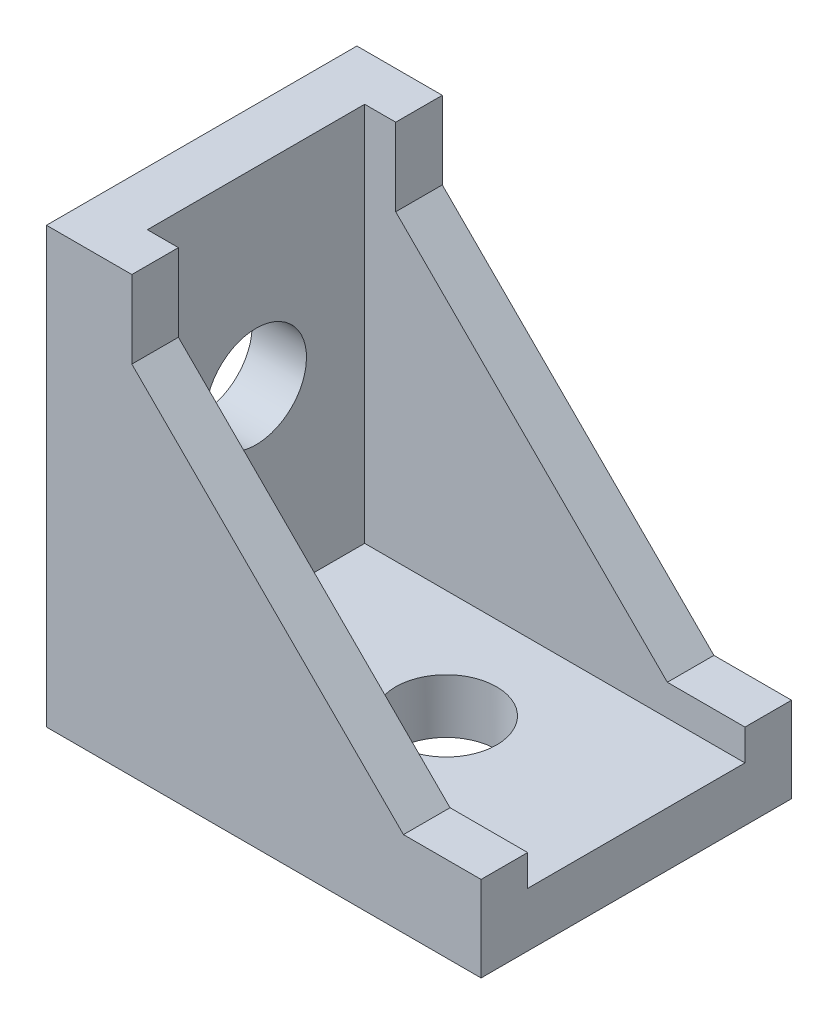
ISO-10303-21;
HEADER;
FILE_DESCRIPTION(('STEP AP214'),'2;1');
FILE_NAME('part.step','',(''),(''),'','','');
FILE_SCHEMA(('AUTOMOTIVE_DESIGN { 1 0 10303 214 1 1 1 1 }'));
ENDSEC;
DATA;
#1=APPLICATION_CONTEXT('core data for automotive mechanical design processes');
#2=APPLICATION_PROTOCOL_DEFINITION('international standard','automotive_design',2000,#1);
#3=PRODUCT_CONTEXT('',#1,'mechanical');
#4=PRODUCT('Part','Part','',(#3));
#5=PRODUCT_RELATED_PRODUCT_CATEGORY('part','',(#4));
#6=PRODUCT_DEFINITION_FORMATION('','',#4);
#7=PRODUCT_DEFINITION_CONTEXT('part definition',#1,'design');
#8=PRODUCT_DEFINITION('design','',#6,#7);
#9=PRODUCT_DEFINITION_SHAPE('','',#8);
#10=(LENGTH_UNIT() NAMED_UNIT(*) SI_UNIT(.MILLI.,.METRE.));
#11=(NAMED_UNIT(*) PLANE_ANGLE_UNIT() SI_UNIT($,.RADIAN.));
#12=(NAMED_UNIT(*) SI_UNIT($,.STERADIAN.) SOLID_ANGLE_UNIT());
#13=UNCERTAINTY_MEASURE_WITH_UNIT(LENGTH_MEASURE(1.E-05),#10,'distance_accuracy_value','');
#14=(GEOMETRIC_REPRESENTATION_CONTEXT(3) GLOBAL_UNCERTAINTY_ASSIGNED_CONTEXT((#13)) GLOBAL_UNIT_ASSIGNED_CONTEXT((#10,
#11,#12)) REPRESENTATION_CONTEXT('',''));
#15=CARTESIAN_POINT('',(0.,0.,0.));
#16=DIRECTION('',(0.,0.,1.));
#17=DIRECTION('',(1.,0.,0.));
#18=AXIS2_PLACEMENT_3D('',#15,#16,#17);
#19=CARTESIAN_POINT('',(3.5,3.5,10.));
#20=DIRECTION('',(0.,-1.,0.));
#21=DIRECTION('',(0.,0.,-1.));
#22=AXIS2_PLACEMENT_3D('',#19,#20,#21);
#23=PLANE('',#22);
#24=CARTESIAN_POINT('',(15.75,3.5,0.));
#25=DIRECTION('',(0.,-1.,0.));
#26=DIRECTION('',(0.,0.,-1.));
#27=AXIS2_PLACEMENT_3D('',#24,#25,#26);
#28=CIRCLE('',#27,3.25);
#29=CARTESIAN_POINT('',(15.75,3.5,-3.25));
#30=VERTEX_POINT('',#29);
#31=EDGE_CURVE('E174',#30,#30,#28,.T.);
#32=ORIENTED_EDGE('',*,*,#31,.T.);
#33=EDGE_LOOP('',(#32));
#34=FACE_BOUND('',#33,.T.);
#35=DIRECTION('',(-1.,0.,0.));
#36=VECTOR('',#35,1.);
#37=CARTESIAN_POINT('',(0.,3.5,-7.));
#38=LINE('',#37,#36);
#39=CARTESIAN_POINT('',(28.,3.5,-7.));
#40=VERTEX_POINT('',#39);
#41=CARTESIAN_POINT('',(3.5,3.5,-7.));
#42=VERTEX_POINT('',#41);
#43=EDGE_CURVE('E51',#40,#42,#38,.T.);
#44=ORIENTED_EDGE('',*,*,#43,.T.);
#45=DIRECTION('',(0.,0.,-1.));
#46=VECTOR('',#45,1.);
#47=CARTESIAN_POINT('',(3.5,3.5,10.));
#48=LINE('',#47,#46);
#49=CARTESIAN_POINT('',(3.5,3.5,7.));
#50=VERTEX_POINT('',#49);
#51=EDGE_CURVE('E245',#50,#42,#48,.T.);
#52=ORIENTED_EDGE('',*,*,#51,.F.);
#53=DIRECTION('',(-1.,0.,0.));
#54=VECTOR('',#53,1.);
#55=CARTESIAN_POINT('',(0.,3.5,7.));
#56=LINE('',#55,#54);
#57=CARTESIAN_POINT('',(28.,3.5,7.));
#58=VERTEX_POINT('',#57);
#59=EDGE_CURVE('E201',#58,#50,#56,.T.);
#60=ORIENTED_EDGE('',*,*,#59,.F.);
#61=DIRECTION('',(0.,0.,-1.));
#62=VECTOR('',#61,1.);
#63=CARTESIAN_POINT('',(28.,3.5,10.));
#64=LINE('',#63,#62);
#65=EDGE_CURVE('E44',#58,#40,#64,.T.);
#66=ORIENTED_EDGE('',*,*,#65,.T.);
#67=EDGE_LOOP('',(#44,#52,#60,#66));
#68=FACE_BOUND('',#67,.T.);
#69=ADVANCED_FACE('F36',(#34,#68),#23,.F.);
#70=CARTESIAN_POINT('',(3.5,28.,10.));
#71=DIRECTION('',(-1.,0.,0.));
#72=DIRECTION('',(0.,-1.,0.));
#73=AXIS2_PLACEMENT_3D('',#70,#71,#72);
#74=PLANE('',#73);
#75=CARTESIAN_POINT('',(3.5,15.75,0.));
#76=DIRECTION('',(1.,0.,0.));
#77=DIRECTION('',(0.,1.,0.));
#78=AXIS2_PLACEMENT_3D('',#75,#76,#77);
#79=CIRCLE('',#78,3.25);
#80=CARTESIAN_POINT('',(3.5,19.,0.));
#81=VERTEX_POINT('',#80);
#82=EDGE_CURVE('E261',#81,#81,#79,.T.);
#83=ORIENTED_EDGE('',*,*,#82,.F.);
#84=EDGE_LOOP('',(#83));
#85=FACE_BOUND('',#84,.T.);
#86=DIRECTION('',(0.,1.,0.));
#87=VECTOR('',#86,1.);
#88=CARTESIAN_POINT('',(3.5,0.,-7.));
#89=LINE('',#88,#87);
#90=CARTESIAN_POINT('',(3.5,28.,-7.));
#91=VERTEX_POINT('',#90);
#92=EDGE_CURVE('E164',#42,#91,#89,.T.);
#93=ORIENTED_EDGE('',*,*,#92,.T.);
#94=DIRECTION('',(0.,0.,-1.));
#95=VECTOR('',#94,1.);
#96=CARTESIAN_POINT('',(3.5,28.,10.));
#97=LINE('',#96,#95);
#98=CARTESIAN_POINT('',(3.5,28.,7.));
#99=VERTEX_POINT('',#98);
#100=EDGE_CURVE('E163',#99,#91,#97,.T.);
#101=ORIENTED_EDGE('',*,*,#100,.F.);
#102=DIRECTION('',(0.,1.,0.));
#103=VECTOR('',#102,1.);
#104=CARTESIAN_POINT('',(3.5,0.,7.));
#105=LINE('',#104,#103);
#106=EDGE_CURVE('E199',#50,#99,#105,.T.);
#107=ORIENTED_EDGE('',*,*,#106,.F.);
#108=ORIENTED_EDGE('',*,*,#51,.T.);
#109=EDGE_LOOP('',(#93,#101,#107,#108));
#110=FACE_BOUND('',#109,.T.);
#111=ADVANCED_FACE('F248',(#85,#110),#74,.F.);
#112=CARTESIAN_POINT('',(28.,0.,10.));
#113=DIRECTION('',(0.,1.,0.));
#114=DIRECTION('',(-1.,0.,0.));
#115=AXIS2_PLACEMENT_3D('',#112,#113,#114);
#116=PLANE('',#115);
#117=CARTESIAN_POINT('',(15.75,0.,0.));
#118=DIRECTION('',(0.,1.,0.));
#119=DIRECTION('',(0.,0.,1.));
#120=AXIS2_PLACEMENT_3D('',#117,#118,#119);
#121=CIRCLE('',#120,3.25);
#122=CARTESIAN_POINT('',(15.75,0.,3.25));
#123=VERTEX_POINT('',#122);
#124=EDGE_CURVE('E257',#123,#123,#121,.T.);
#125=ORIENTED_EDGE('',*,*,#124,.T.);
#126=EDGE_LOOP('',(#125));
#127=FACE_BOUND('',#126,.T.);
#128=DIRECTION('',(1.,0.,0.));
#129=VECTOR('',#128,1.);
#130=CARTESIAN_POINT('',(28.,0.,-10.));
#131=LINE('',#130,#129);
#132=CARTESIAN_POINT('',(0.,0.,-10.));
#133=VERTEX_POINT('',#132);
#134=CARTESIAN_POINT('',(28.,0.,-10.));
#135=VERTEX_POINT('',#134);
#136=EDGE_CURVE('E212',#133,#135,#131,.T.);
#137=ORIENTED_EDGE('',*,*,#136,.T.);
#138=DIRECTION('',(0.,0.,-1.));
#139=VECTOR('',#138,1.);
#140=CARTESIAN_POINT('',(28.,0.,10.));
#141=LINE('',#140,#139);
#142=CARTESIAN_POINT('',(28.,0.,10.));
#143=VERTEX_POINT('',#142);
#144=EDGE_CURVE('E11',#143,#135,#141,.T.);
#145=ORIENTED_EDGE('',*,*,#144,.F.);
#146=DIRECTION('',(1.,0.,0.));
#147=VECTOR('',#146,1.);
#148=CARTESIAN_POINT('',(28.,0.,10.));
#149=LINE('',#148,#147);
#150=CARTESIAN_POINT('',(0.,0.,10.));
#151=VERTEX_POINT('',#150);
#152=EDGE_CURVE('E221',#151,#143,#149,.T.);
#153=ORIENTED_EDGE('',*,*,#152,.F.);
#154=DIRECTION('',(0.,0.,-1.));
#155=VECTOR('',#154,1.);
#156=CARTESIAN_POINT('',(0.,0.,10.));
#157=LINE('',#156,#155);
#158=EDGE_CURVE('E231',#151,#133,#157,.T.);
#159=ORIENTED_EDGE('',*,*,#158,.T.);
#160=EDGE_LOOP('',(#137,#145,#153,#159));
#161=FACE_BOUND('',#160,.T.);
#162=ADVANCED_FACE('F38',(#127,#161),#116,.F.);
#163=CARTESIAN_POINT('',(28.,3.5,10.));
#164=DIRECTION('',(-1.,0.,0.));
#165=DIRECTION('',(0.,0.,1.));
#166=AXIS2_PLACEMENT_3D('',#163,#164,#165);
#167=PLANE('',#166);
#168=DIRECTION('',(0.,1.,0.));
#169=VECTOR('',#168,1.);
#170=CARTESIAN_POINT('',(28.,3.5,-10.));
#171=LINE('',#170,#169);
#172=CARTESIAN_POINT('',(28.,5.5,-10.));
#173=VERTEX_POINT('',#172);
#174=EDGE_CURVE('E234',#135,#173,#171,.T.);
#175=ORIENTED_EDGE('',*,*,#174,.T.);
#176=DIRECTION('',(0.,0.,-1.));
#177=VECTOR('',#176,1.);
#178=CARTESIAN_POINT('',(28.,5.5,-7.));
#179=LINE('',#178,#177);
#180=CARTESIAN_POINT('',(28.,5.5,-7.));
#181=VERTEX_POINT('',#180);
#182=EDGE_CURVE('E181',#181,#173,#179,.T.);
#183=ORIENTED_EDGE('',*,*,#182,.F.);
#184=DIRECTION('',(0.,-1.,0.));
#185=VECTOR('',#184,1.);
#186=CARTESIAN_POINT('',(28.,0.,-7.));
#187=LINE('',#186,#185);
#188=EDGE_CURVE('E180',#181,#40,#187,.T.);
#189=ORIENTED_EDGE('',*,*,#188,.T.);
#190=ORIENTED_EDGE('',*,*,#65,.F.);
#191=DIRECTION('',(0.,-1.,0.));
#192=VECTOR('',#191,1.);
#193=CARTESIAN_POINT('',(28.,0.,7.));
#194=LINE('',#193,#192);
#195=CARTESIAN_POINT('',(28.,5.5,7.));
#196=VERTEX_POINT('',#195);
#197=EDGE_CURVE('E188',#196,#58,#194,.T.);
#198=ORIENTED_EDGE('',*,*,#197,.F.);
#199=DIRECTION('',(0.,0.,1.));
#200=VECTOR('',#199,1.);
#201=CARTESIAN_POINT('',(28.,5.5,7.));
#202=LINE('',#201,#200);
#203=CARTESIAN_POINT('',(28.,5.5,10.));
#204=VERTEX_POINT('',#203);
#205=EDGE_CURVE('E203',#196,#204,#202,.T.);
#206=ORIENTED_EDGE('',*,*,#205,.T.);
#207=DIRECTION('',(0.,1.,0.));
#208=VECTOR('',#207,1.);
#209=CARTESIAN_POINT('',(28.,3.5,10.));
#210=LINE('',#209,#208);
#211=EDGE_CURVE('E224',#143,#204,#210,.T.);
#212=ORIENTED_EDGE('',*,*,#211,.F.);
#213=ORIENTED_EDGE('',*,*,#144,.T.);
#214=EDGE_LOOP('',(#175,#183,#189,#190,#198,#206,#212,#213));
#215=FACE_BOUND('',#214,.T.);
#216=ADVANCED_FACE('F251',(#215),#167,.F.);
#217=CARTESIAN_POINT('',(0.,28.,10.));
#218=DIRECTION('',(0.,-1.,0.));
#219=DIRECTION('',(0.,0.,-1.));
#220=AXIS2_PLACEMENT_3D('',#217,#218,#219);
#221=PLANE('',#220);
#222=DIRECTION('',(-1.,0.,0.));
#223=VECTOR('',#222,1.);
#224=CARTESIAN_POINT('',(0.,28.,-10.));
#225=LINE('',#224,#223);
#226=CARTESIAN_POINT('',(5.5,28.,-10.));
#227=VERTEX_POINT('',#226);
#228=CARTESIAN_POINT('',(0.,28.,-10.));
#229=VERTEX_POINT('',#228);
#230=EDGE_CURVE('E236',#227,#229,#225,.T.);
#231=ORIENTED_EDGE('',*,*,#230,.T.);
#232=DIRECTION('',(0.,0.,-1.));
#233=VECTOR('',#232,1.);
#234=CARTESIAN_POINT('',(0.,28.,10.));
#235=LINE('',#234,#233);
#236=CARTESIAN_POINT('',(0.,28.,10.));
#237=VERTEX_POINT('',#236);
#238=EDGE_CURVE('E241',#237,#229,#235,.T.);
#239=ORIENTED_EDGE('',*,*,#238,.F.);
#240=DIRECTION('',(-1.,0.,0.));
#241=VECTOR('',#240,1.);
#242=CARTESIAN_POINT('',(0.,28.,10.));
#243=LINE('',#242,#241);
#244=CARTESIAN_POINT('',(5.5,28.,10.));
#245=VERTEX_POINT('',#244);
#246=EDGE_CURVE('E227',#245,#237,#243,.T.);
#247=ORIENTED_EDGE('',*,*,#246,.F.);
#248=DIRECTION('',(0.,0.,1.));
#249=VECTOR('',#248,1.);
#250=CARTESIAN_POINT('',(5.5,28.,7.));
#251=LINE('',#250,#249);
#252=CARTESIAN_POINT('',(5.5,28.,7.));
#253=VERTEX_POINT('',#252);
#254=EDGE_CURVE('E209',#253,#245,#251,.T.);
#255=ORIENTED_EDGE('',*,*,#254,.F.);
#256=DIRECTION('',(1.,0.,0.));
#257=VECTOR('',#256,1.);
#258=CARTESIAN_POINT('',(0.,28.,7.));
#259=LINE('',#258,#257);
#260=EDGE_CURVE('E197',#99,#253,#259,.T.);
#261=ORIENTED_EDGE('',*,*,#260,.F.);
#262=ORIENTED_EDGE('',*,*,#100,.T.);
#263=DIRECTION('',(1.,0.,0.));
#264=VECTOR('',#263,1.);
#265=CARTESIAN_POINT('',(0.,28.,-7.));
#266=LINE('',#265,#264);
#267=CARTESIAN_POINT('',(5.5,28.,-7.));
#268=VERTEX_POINT('',#267);
#269=EDGE_CURVE('E154',#91,#268,#266,.T.);
#270=ORIENTED_EDGE('',*,*,#269,.T.);
#271=DIRECTION('',(0.,0.,-1.));
#272=VECTOR('',#271,1.);
#273=CARTESIAN_POINT('',(5.5,28.,-7.));
#274=LINE('',#273,#272);
#275=EDGE_CURVE('E137',#268,#227,#274,.T.);
#276=ORIENTED_EDGE('',*,*,#275,.T.);
#277=EDGE_LOOP('',(#231,#239,#247,#255,#261,#262,#270,#276));
#278=FACE_BOUND('',#277,.T.);
#279=ADVANCED_FACE('F160',(#278),#221,.F.);
#280=CARTESIAN_POINT('',(0.,0.,10.));
#281=DIRECTION('',(1.,0.,0.));
#282=DIRECTION('',(0.,0.,-1.));
#283=AXIS2_PLACEMENT_3D('',#280,#281,#282);
#284=PLANE('',#283);
#285=CARTESIAN_POINT('',(0.,15.75,0.));
#286=DIRECTION('',(1.,0.,0.));
#287=DIRECTION('',(0.,1.,0.));
#288=AXIS2_PLACEMENT_3D('',#285,#286,#287);
#289=CIRCLE('',#288,3.25);
#290=CARTESIAN_POINT('',(0.,19.,0.));
#291=VERTEX_POINT('',#290);
#292=EDGE_CURVE('E260',#291,#291,#289,.T.);
#293=ORIENTED_EDGE('',*,*,#292,.T.);
#294=EDGE_LOOP('',(#293));
#295=FACE_BOUND('',#294,.T.);
#296=DIRECTION('',(0.,-1.,0.));
#297=VECTOR('',#296,1.);
#298=CARTESIAN_POINT('',(0.,0.,-10.));
#299=LINE('',#298,#297);
#300=EDGE_CURVE('E225',#229,#133,#299,.T.);
#301=ORIENTED_EDGE('',*,*,#300,.T.);
#302=ORIENTED_EDGE('',*,*,#158,.F.);
#303=DIRECTION('',(0.,-1.,0.));
#304=VECTOR('',#303,1.);
#305=CARTESIAN_POINT('',(0.,0.,10.));
#306=LINE('',#305,#304);
#307=EDGE_CURVE('E229',#237,#151,#306,.T.);
#308=ORIENTED_EDGE('',*,*,#307,.F.);
#309=ORIENTED_EDGE('',*,*,#238,.T.);
#310=EDGE_LOOP('',(#301,#302,#308,#309));
#311=FACE_BOUND('',#310,.T.);
#312=ADVANCED_FACE('F267',(#295,#311),#284,.F.);
#313=CARTESIAN_POINT('',(0.,0.,10.));
#314=DIRECTION('',(0.,0.,-1.));
#315=DIRECTION('',(-1.,0.,0.));
#316=AXIS2_PLACEMENT_3D('',#313,#314,#315);
#317=PLANE('',#316);
#318=ORIENTED_EDGE('',*,*,#152,.T.);
#319=ORIENTED_EDGE('',*,*,#211,.T.);
#320=DIRECTION('',(1.,0.,0.));
#321=VECTOR('',#320,1.);
#322=CARTESIAN_POINT('',(0.,5.5,10.));
#323=LINE('',#322,#321);
#324=CARTESIAN_POINT('',(23.,5.5,10.));
#325=VERTEX_POINT('',#324);
#326=EDGE_CURVE('E184',#325,#204,#323,.T.);
#327=ORIENTED_EDGE('',*,*,#326,.F.);
#328=DIRECTION('',(0.707106781186551,-0.707106781186544,0.));
#329=VECTOR('',#328,1.);
#330=CARTESIAN_POINT('',(14.2499999999999,14.25,10.));
#331=LINE('',#330,#329);
#332=CARTESIAN_POINT('',(5.5,22.9999999999998,10.));
#333=VERTEX_POINT('',#332);
#334=EDGE_CURVE('E206',#333,#325,#331,.T.);
#335=ORIENTED_EDGE('',*,*,#334,.F.);
#336=DIRECTION('',(0.,-1.,0.));
#337=VECTOR('',#336,1.);
#338=CARTESIAN_POINT('',(5.50000000000001,0.,10.));
#339=LINE('',#338,#337);
#340=EDGE_CURVE('E191',#245,#333,#339,.T.);
#341=ORIENTED_EDGE('',*,*,#340,.F.);
#342=ORIENTED_EDGE('',*,*,#246,.T.);
#343=ORIENTED_EDGE('',*,*,#307,.T.);
#344=EDGE_LOOP('',(#318,#319,#327,#335,#341,#342,#343));
#345=FACE_BOUND('',#344,.T.);
#346=ADVANCED_FACE('F295',(#345),#317,.F.);
#347=CARTESIAN_POINT('',(0.,0.,-10.));
#348=DIRECTION('',(0.,0.,-1.));
#349=DIRECTION('',(-1.,0.,0.));
#350=AXIS2_PLACEMENT_3D('',#347,#348,#349);
#351=PLANE('',#350);
#352=ORIENTED_EDGE('',*,*,#230,.F.);
#353=DIRECTION('',(0.,-1.,0.));
#354=VECTOR('',#353,1.);
#355=CARTESIAN_POINT('',(5.50000000000001,0.,-10.));
#356=LINE('',#355,#354);
#357=CARTESIAN_POINT('',(5.5,22.9999999999998,-10.));
#358=VERTEX_POINT('',#357);
#359=EDGE_CURVE('E142',#227,#358,#356,.T.);
#360=ORIENTED_EDGE('',*,*,#359,.T.);
#361=DIRECTION('',(0.707106781186551,-0.707106781186544,0.));
#362=VECTOR('',#361,1.);
#363=CARTESIAN_POINT('',(14.2499999999999,14.25,-10.));
#364=LINE('',#363,#362);
#365=CARTESIAN_POINT('',(23.,5.5,-10.));
#366=VERTEX_POINT('',#365);
#367=EDGE_CURVE('E173',#358,#366,#364,.T.);
#368=ORIENTED_EDGE('',*,*,#367,.T.);
#369=DIRECTION('',(1.,0.,0.));
#370=VECTOR('',#369,1.);
#371=CARTESIAN_POINT('',(0.,5.5,-10.));
#372=LINE('',#371,#370);
#373=EDGE_CURVE('E177',#366,#173,#372,.T.);
#374=ORIENTED_EDGE('',*,*,#373,.T.);
#375=ORIENTED_EDGE('',*,*,#174,.F.);
#376=ORIENTED_EDGE('',*,*,#136,.F.);
#377=ORIENTED_EDGE('',*,*,#300,.F.);
#378=EDGE_LOOP('',(#352,#360,#368,#374,#375,#376,#377));
#379=FACE_BOUND('',#378,.T.);
#380=ADVANCED_FACE('F299',(#379),#351,.T.);
#381=CARTESIAN_POINT('',(5.50000000000001,0.,7.));
#382=DIRECTION('',(-1.,0.,0.));
#383=DIRECTION('',(0.,-1.,0.));
#384=AXIS2_PLACEMENT_3D('',#381,#382,#383);
#385=PLANE('',#384);
#386=ORIENTED_EDGE('',*,*,#340,.T.);
#387=DIRECTION('',(0.,0.,1.));
#388=VECTOR('',#387,1.);
#389=CARTESIAN_POINT('',(5.5,22.9999999999998,7.));
#390=LINE('',#389,#388);
#391=CARTESIAN_POINT('',(5.5,22.9999999999998,7.));
#392=VERTEX_POINT('',#391);
#393=EDGE_CURVE('E213',#392,#333,#390,.T.);
#394=ORIENTED_EDGE('',*,*,#393,.F.);
#395=DIRECTION('',(0.,-1.,0.));
#396=VECTOR('',#395,1.);
#397=CARTESIAN_POINT('',(5.50000000000001,0.,7.));
#398=LINE('',#397,#396);
#399=EDGE_CURVE('E195',#253,#392,#398,.T.);
#400=ORIENTED_EDGE('',*,*,#399,.F.);
#401=ORIENTED_EDGE('',*,*,#254,.T.);
#402=EDGE_LOOP('',(#386,#394,#400,#401));
#403=FACE_BOUND('',#402,.T.);
#404=ADVANCED_FACE('F304',(#403),#385,.F.);
#405=CARTESIAN_POINT('',(14.2499999999999,14.25,7.));
#406=DIRECTION('',(-0.707106781186544,-0.707106781186551,0.));
#407=DIRECTION('',(0.707106781186551,-0.707106781186544,0.));
#408=AXIS2_PLACEMENT_3D('',#405,#406,#407);
#409=PLANE('',#408);
#410=ORIENTED_EDGE('',*,*,#334,.T.);
#411=DIRECTION('',(0.,0.,1.));
#412=VECTOR('',#411,1.);
#413=CARTESIAN_POINT('',(23.,5.5,7.));
#414=LINE('',#413,#412);
#415=CARTESIAN_POINT('',(23.,5.5,7.));
#416=VERTEX_POINT('',#415);
#417=EDGE_CURVE('E216',#416,#325,#414,.T.);
#418=ORIENTED_EDGE('',*,*,#417,.F.);
#419=DIRECTION('',(0.707106781186551,-0.707106781186544,0.));
#420=VECTOR('',#419,1.);
#421=CARTESIAN_POINT('',(14.2499999999999,14.25,7.));
#422=LINE('',#421,#420);
#423=EDGE_CURVE('E193',#392,#416,#422,.T.);
#424=ORIENTED_EDGE('',*,*,#423,.F.);
#425=ORIENTED_EDGE('',*,*,#393,.T.);
#426=EDGE_LOOP('',(#410,#418,#424,#425));
#427=FACE_BOUND('',#426,.T.);
#428=ADVANCED_FACE('F311',(#427),#409,.F.);
#429=CARTESIAN_POINT('',(0.,5.5,7.));
#430=DIRECTION('',(0.,-1.,0.));
#431=DIRECTION('',(0.,0.,-1.));
#432=AXIS2_PLACEMENT_3D('',#429,#430,#431);
#433=PLANE('',#432);
#434=ORIENTED_EDGE('',*,*,#326,.T.);
#435=ORIENTED_EDGE('',*,*,#205,.F.);
#436=DIRECTION('',(1.,0.,0.));
#437=VECTOR('',#436,1.);
#438=CARTESIAN_POINT('',(0.,5.5,7.));
#439=LINE('',#438,#437);
#440=EDGE_CURVE('E190',#416,#196,#439,.T.);
#441=ORIENTED_EDGE('',*,*,#440,.F.);
#442=ORIENTED_EDGE('',*,*,#417,.T.);
#443=EDGE_LOOP('',(#434,#435,#441,#442));
#444=FACE_BOUND('',#443,.T.);
#445=ADVANCED_FACE('F307',(#444),#433,.F.);
#446=CARTESIAN_POINT('',(0.,0.,7.));
#447=DIRECTION('',(0.,0.,1.));
#448=DIRECTION('',(1.,0.,0.));
#449=AXIS2_PLACEMENT_3D('',#446,#447,#448);
#450=PLANE('',#449);
#451=ORIENTED_EDGE('',*,*,#197,.T.);
#452=ORIENTED_EDGE('',*,*,#59,.T.);
#453=ORIENTED_EDGE('',*,*,#106,.T.);
#454=ORIENTED_EDGE('',*,*,#260,.T.);
#455=ORIENTED_EDGE('',*,*,#399,.T.);
#456=ORIENTED_EDGE('',*,*,#423,.T.);
#457=ORIENTED_EDGE('',*,*,#440,.T.);
#458=EDGE_LOOP('',(#451,#452,#453,#454,#455,#456,#457));
#459=FACE_BOUND('',#458,.T.);
#460=ADVANCED_FACE('F310',(#459),#450,.F.);
#461=CARTESIAN_POINT('',(0.,5.5,-7.));
#462=DIRECTION('',(0.,1.,0.));
#463=DIRECTION('',(0.,0.,1.));
#464=AXIS2_PLACEMENT_3D('',#461,#462,#463);
#465=PLANE('',#464);
#466=ORIENTED_EDGE('',*,*,#373,.F.);
#467=DIRECTION('',(0.,0.,-1.));
#468=VECTOR('',#467,1.);
#469=CARTESIAN_POINT('',(23.,5.5,-7.));
#470=LINE('',#469,#468);
#471=CARTESIAN_POINT('',(23.,5.5,-7.));
#472=VERTEX_POINT('',#471);
#473=EDGE_CURVE('E185',#472,#366,#470,.T.);
#474=ORIENTED_EDGE('',*,*,#473,.F.);
#475=DIRECTION('',(1.,0.,0.));
#476=VECTOR('',#475,1.);
#477=CARTESIAN_POINT('',(0.,5.5,-7.));
#478=LINE('',#477,#476);
#479=EDGE_CURVE('E146',#472,#181,#478,.T.);
#480=ORIENTED_EDGE('',*,*,#479,.T.);
#481=ORIENTED_EDGE('',*,*,#182,.T.);
#482=EDGE_LOOP('',(#466,#474,#480,#481));
#483=FACE_BOUND('',#482,.T.);
#484=ADVANCED_FACE('F321',(#483),#465,.T.);
#485=CARTESIAN_POINT('',(14.2499999999999,14.25,-7.));
#486=DIRECTION('',(0.707106781186544,0.707106781186551,0.));
#487=DIRECTION('',(-0.707106781186551,0.707106781186544,0.));
#488=AXIS2_PLACEMENT_3D('',#485,#486,#487);
#489=PLANE('',#488);
#490=ORIENTED_EDGE('',*,*,#367,.F.);
#491=DIRECTION('',(0.,0.,-1.));
#492=VECTOR('',#491,1.);
#493=CARTESIAN_POINT('',(5.5,22.9999999999998,-7.));
#494=LINE('',#493,#492);
#495=CARTESIAN_POINT('',(5.5,22.9999999999998,-7.));
#496=VERTEX_POINT('',#495);
#497=EDGE_CURVE('E145',#496,#358,#494,.T.);
#498=ORIENTED_EDGE('',*,*,#497,.F.);
#499=DIRECTION('',(0.707106781186551,-0.707106781186544,0.));
#500=VECTOR('',#499,1.);
#501=CARTESIAN_POINT('',(14.2499999999999,14.25,-7.));
#502=LINE('',#501,#500);
#503=EDGE_CURVE('E157',#496,#472,#502,.T.);
#504=ORIENTED_EDGE('',*,*,#503,.T.);
#505=ORIENTED_EDGE('',*,*,#473,.T.);
#506=EDGE_LOOP('',(#490,#498,#504,#505));
#507=FACE_BOUND('',#506,.T.);
#508=ADVANCED_FACE('F325',(#507),#489,.T.);
#509=CARTESIAN_POINT('',(5.50000000000001,0.,-7.));
#510=DIRECTION('',(1.,0.,0.));
#511=DIRECTION('',(0.,1.,0.));
#512=AXIS2_PLACEMENT_3D('',#509,#510,#511);
#513=PLANE('',#512);
#514=ORIENTED_EDGE('',*,*,#359,.F.);
#515=ORIENTED_EDGE('',*,*,#275,.F.);
#516=DIRECTION('',(0.,-1.,0.));
#517=VECTOR('',#516,1.);
#518=CARTESIAN_POINT('',(5.50000000000001,0.,-7.));
#519=LINE('',#518,#517);
#520=EDGE_CURVE('E140',#268,#496,#519,.T.);
#521=ORIENTED_EDGE('',*,*,#520,.T.);
#522=ORIENTED_EDGE('',*,*,#497,.T.);
#523=EDGE_LOOP('',(#514,#515,#521,#522));
#524=FACE_BOUND('',#523,.T.);
#525=ADVANCED_FACE('F139',(#524),#513,.T.);
#526=CARTESIAN_POINT('',(0.,0.,-7.));
#527=DIRECTION('',(0.,0.,-1.));
#528=DIRECTION('',(1.,0.,0.));
#529=AXIS2_PLACEMENT_3D('',#526,#527,#528);
#530=PLANE('',#529);
#531=ORIENTED_EDGE('',*,*,#188,.F.);
#532=ORIENTED_EDGE('',*,*,#479,.F.);
#533=ORIENTED_EDGE('',*,*,#503,.F.);
#534=ORIENTED_EDGE('',*,*,#520,.F.);
#535=ORIENTED_EDGE('',*,*,#269,.F.);
#536=ORIENTED_EDGE('',*,*,#92,.F.);
#537=ORIENTED_EDGE('',*,*,#43,.F.);
#538=EDGE_LOOP('',(#531,#532,#533,#534,#535,#536,#537));
#539=FACE_BOUND('',#538,.T.);
#540=ADVANCED_FACE('F152',(#539),#530,.F.);
#541=CARTESIAN_POINT('',(15.75,0.,0.));
#542=DIRECTION('',(0.,1.,0.));
#543=DIRECTION('',(0.,0.,1.));
#544=AXIS2_PLACEMENT_3D('',#541,#542,#543);
#545=CYLINDRICAL_SURFACE('',#544,3.25);
#546=ORIENTED_EDGE('',*,*,#124,.F.);
#547=EDGE_LOOP('',(#546));
#548=FACE_BOUND('',#547,.T.);
#549=ORIENTED_EDGE('',*,*,#31,.F.);
#550=EDGE_LOOP('',(#549));
#551=FACE_BOUND('',#550,.T.);
#552=ADVANCED_FACE('F273',(#548,#551),#545,.F.);
#553=CARTESIAN_POINT('',(0.,15.75,0.));
#554=DIRECTION('',(1.,0.,0.));
#555=DIRECTION('',(0.,1.,0.));
#556=AXIS2_PLACEMENT_3D('',#553,#554,#555);
#557=CYLINDRICAL_SURFACE('',#556,3.25);
#558=CARTESIAN_POINT('',(0.,19.,0.));
#559=CARTESIAN_POINT('',(0.0364583333333312,19.,0.));
#560=CARTESIAN_POINT('',(0.0729166666666646,19.,0.));
#561=CARTESIAN_POINT('',(0.145833333333331,19.,0.));
#562=CARTESIAN_POINT('',(0.182291666666665,19.,0.));
#563=CARTESIAN_POINT('',(0.255208333333331,19.,0.));
#564=CARTESIAN_POINT('',(0.291666666666665,19.,0.));
#565=CARTESIAN_POINT('',(0.364583333333332,19.,0.));
#566=CARTESIAN_POINT('',(0.401041666666665,19.,0.));
#567=CARTESIAN_POINT('',(0.473958333333332,19.,0.));
#568=CARTESIAN_POINT('',(0.510416666666665,19.,0.));
#569=CARTESIAN_POINT('',(0.583333333333332,19.,0.));
#570=CARTESIAN_POINT('',(0.619791666666665,19.,0.));
#571=CARTESIAN_POINT('',(0.692708333333332,19.,0.));
#572=CARTESIAN_POINT('',(0.729166666666665,19.,0.));
#573=CARTESIAN_POINT('',(0.802083333333332,19.,0.));
#574=CARTESIAN_POINT('',(0.838541666666665,19.,0.));
#575=CARTESIAN_POINT('',(0.911458333333332,19.,0.));
#576=CARTESIAN_POINT('',(0.947916666666665,19.,0.));
#577=CARTESIAN_POINT('',(1.02083333333333,19.,0.));
#578=CARTESIAN_POINT('',(1.05729166666667,19.,0.));
#579=CARTESIAN_POINT('',(1.13020833333333,19.,0.));
#580=CARTESIAN_POINT('',(1.16666666666667,19.,0.));
#581=CARTESIAN_POINT('',(1.23958333333333,19.,0.));
#582=CARTESIAN_POINT('',(1.27604166666667,19.,0.));
#583=CARTESIAN_POINT('',(1.34895833333333,19.,0.));
#584=CARTESIAN_POINT('',(1.38541666666667,19.,0.));
#585=CARTESIAN_POINT('',(1.45833333333333,19.,0.));
#586=CARTESIAN_POINT('',(1.49479166666667,19.,0.));
#587=CARTESIAN_POINT('',(1.56770833333333,19.,0.));
#588=CARTESIAN_POINT('',(1.60416666666667,19.,0.));
#589=CARTESIAN_POINT('',(1.67708333333333,19.,0.));
#590=CARTESIAN_POINT('',(1.71354166666667,19.,0.));
#591=CARTESIAN_POINT('',(1.78645833333333,19.,0.));
#592=CARTESIAN_POINT('',(1.82291666666667,19.,0.));
#593=CARTESIAN_POINT('',(1.89583333333333,19.,0.));
#594=CARTESIAN_POINT('',(1.93229166666667,19.,0.));
#595=CARTESIAN_POINT('',(2.00520833333333,19.,0.));
#596=CARTESIAN_POINT('',(2.04166666666667,19.,0.));
#597=CARTESIAN_POINT('',(2.11458333333333,19.,0.));
#598=CARTESIAN_POINT('',(2.15104166666667,19.,0.));
#599=CARTESIAN_POINT('',(2.22395833333333,19.,0.));
#600=CARTESIAN_POINT('',(2.26041666666667,19.,0.));
#601=CARTESIAN_POINT('',(2.33333333333333,19.,0.));
#602=CARTESIAN_POINT('',(2.36979166666667,19.,0.));
#603=CARTESIAN_POINT('',(2.44270833333333,19.,0.));
#604=CARTESIAN_POINT('',(2.47916666666667,19.,0.));
#605=CARTESIAN_POINT('',(2.55208333333333,19.,0.));
#606=CARTESIAN_POINT('',(2.58854166666667,19.,0.));
#607=CARTESIAN_POINT('',(2.66145833333333,19.,0.));
#608=CARTESIAN_POINT('',(2.69791666666667,19.,0.));
#609=CARTESIAN_POINT('',(2.77083333333333,19.,0.));
#610=CARTESIAN_POINT('',(2.80729166666667,19.,0.));
#611=CARTESIAN_POINT('',(2.88020833333333,19.,0.));
#612=CARTESIAN_POINT('',(2.91666666666667,19.,0.));
#613=CARTESIAN_POINT('',(2.98958333333333,19.,0.));
#614=CARTESIAN_POINT('',(3.02604166666667,19.,0.));
#615=CARTESIAN_POINT('',(3.09895833333333,19.,0.));
#616=CARTESIAN_POINT('',(3.13541666666667,19.,0.));
#617=CARTESIAN_POINT('',(3.20833333333333,19.,0.));
#618=CARTESIAN_POINT('',(3.24479166666667,19.,0.));
#619=CARTESIAN_POINT('',(3.31770833333333,19.,0.));
#620=CARTESIAN_POINT('',(3.35416666666667,19.,0.));
#621=CARTESIAN_POINT('',(3.42708333333333,19.,0.));
#622=CARTESIAN_POINT('',(3.46354166666667,19.,0.));
#623=CARTESIAN_POINT('',(3.5,19.,0.));
#624=B_SPLINE_CURVE_WITH_KNOTS('',3,(#558,#559,#560,#561,#562,#563,#564,#565,#566,#567,#568,
#569,#570,#571,#572,#573,#574,#575,#576,#577,#578,#579,#580,#581,#582,#583,#584,#585,#586,#587,
#588,#589,#590,#591,#592,#593,#594,#595,#596,#597,#598,#599,#600,#601,#602,#603,#604,#605,#606,
#607,#608,#609,#610,#611,#612,#613,#614,#615,#616,#617,#618,#619,#620,#621,#622,#623),
.UNSPECIFIED.,.F.,.F.,(4,2,2,2,2,2,2,2,2,2,2,2,2,2,2,2,2,2,2,2,2,2,2,2,2,2,2,2,2,2,2,2,4),(0.,
0.109375,0.21875,0.328125,0.4375,0.546875,0.656250000000001,0.765625000000001,0.875000000000001,
0.984375000000001,1.09375,1.203125,1.3125,1.421875,1.53125,1.640625,1.75,1.859375,1.96875,
2.078125,2.1875,2.296875,2.40625,2.515625,2.625,2.734375,2.84375,2.953125,3.0625,3.171875,
3.28125,3.390625,3.5),.UNSPECIFIED.);
#625=EDGE_CURVE('BSEAM270',#291,#81,#624,.T.);
#626=ORIENTED_EDGE('',*,*,#292,.F.);
#627=ORIENTED_EDGE('',*,*,#82,.T.);
#628=ORIENTED_EDGE('',*,*,#625,.T.);
#629=ORIENTED_EDGE('',*,*,#625,.F.);
#630=EDGE_LOOP('',(#626,#628,#627,#629));
#631=FACE_BOUND('',#630,.T.);
#632=ADVANCED_FACE('F270',(#631),#557,.F.);
#633=CLOSED_SHELL('',(#69,#111,#162,#216,#279,#312,#346,#380,#404,#428,#445,#460,#484,#508,#525,
#540,#552,#632));
#634=MANIFOLD_SOLID_BREP('B2',#633);
#635=ADVANCED_BREP_SHAPE_REPRESENTATION('',(#18,#634),#14);
#636=SHAPE_DEFINITION_REPRESENTATION(#9,#635);
ENDSEC;
END-ISO-10303-21;
